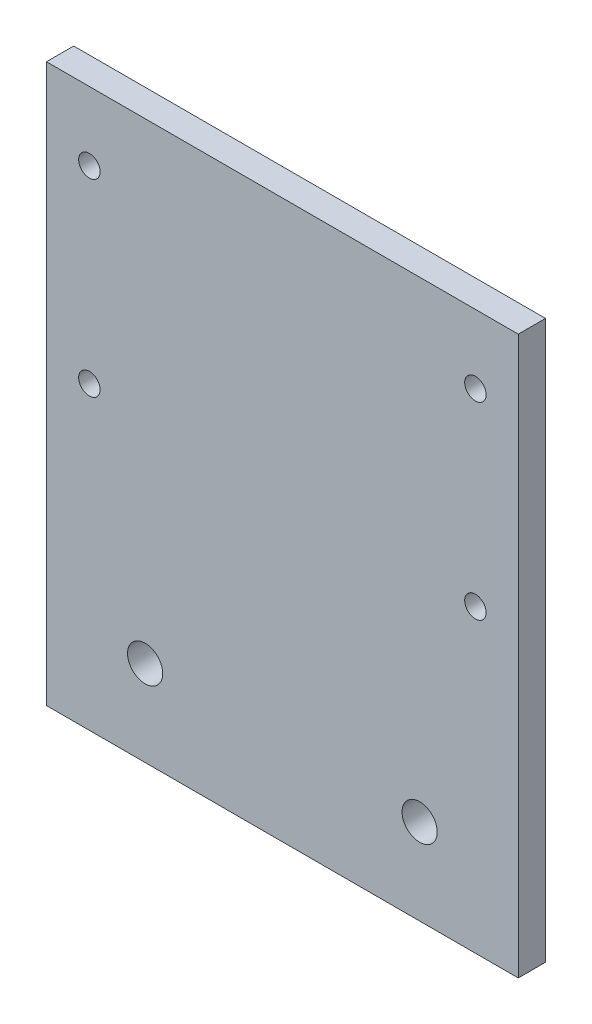
ISO-10303-21;
HEADER;
FILE_DESCRIPTION(('STEP AP214'),'2;1');
FILE_NAME('part.step','',(''),(''),'','','');
FILE_SCHEMA(('AUTOMOTIVE_DESIGN { 1 0 10303 214 1 1 1 1 }'));
ENDSEC;
DATA;
#1=APPLICATION_CONTEXT('core data for automotive mechanical design processes');
#2=APPLICATION_PROTOCOL_DEFINITION('international standard','automotive_design',2000,#1);
#3=PRODUCT_CONTEXT('',#1,'mechanical');
#4=PRODUCT('Part','Part','',(#3));
#5=PRODUCT_RELATED_PRODUCT_CATEGORY('part','',(#4));
#6=PRODUCT_DEFINITION_FORMATION('','',#4);
#7=PRODUCT_DEFINITION_CONTEXT('part definition',#1,'design');
#8=PRODUCT_DEFINITION('design','',#6,#7);
#9=PRODUCT_DEFINITION_SHAPE('','',#8);
#10=(LENGTH_UNIT() NAMED_UNIT(*) SI_UNIT(.MILLI.,.METRE.));
#11=(NAMED_UNIT(*) PLANE_ANGLE_UNIT() SI_UNIT($,.RADIAN.));
#12=(NAMED_UNIT(*) SI_UNIT($,.STERADIAN.) SOLID_ANGLE_UNIT());
#13=UNCERTAINTY_MEASURE_WITH_UNIT(LENGTH_MEASURE(1.E-05),#10,'distance_accuracy_value','');
#14=(GEOMETRIC_REPRESENTATION_CONTEXT(3) GLOBAL_UNCERTAINTY_ASSIGNED_CONTEXT((#13)) GLOBAL_UNIT_ASSIGNED_CONTEXT((#10,
#11,#12)) REPRESENTATION_CONTEXT('',''));
#15=CARTESIAN_POINT('',(0.,0.,0.));
#16=DIRECTION('',(0.,0.,1.));
#17=DIRECTION('',(1.,0.,0.));
#18=AXIS2_PLACEMENT_3D('',#15,#16,#17);
#19=CARTESIAN_POINT('',(0.,0.,3.175));
#20=DIRECTION('',(0.,0.,-1.));
#21=DIRECTION('',(-1.,0.,0.));
#22=AXIS2_PLACEMENT_3D('',#19,#20,#21);
#23=PLANE('',#22);
#24=DIRECTION('',(0.,-1.,0.));
#25=VECTOR('',#24,1.);
#26=CARTESIAN_POINT('',(0.,0.,3.175));
#27=LINE('',#26,#25);
#28=CARTESIAN_POINT('',(0.,65.,3.175));
#29=VERTEX_POINT('',#28);
#30=CARTESIAN_POINT('',(0.,0.,3.175));
#31=VERTEX_POINT('',#30);
#32=EDGE_CURVE('E92',#29,#31,#27,.T.);
#33=ORIENTED_EDGE('',*,*,#32,.T.);
#34=DIRECTION('',(1.,0.,0.));
#35=VECTOR('',#34,1.);
#36=CARTESIAN_POINT('',(0.,0.,3.175));
#37=LINE('',#36,#35);
#38=CARTESIAN_POINT('',(55.,0.,3.175));
#39=VERTEX_POINT('',#38);
#40=EDGE_CURVE('E87',#31,#39,#37,.T.);
#41=ORIENTED_EDGE('',*,*,#40,.T.);
#42=DIRECTION('',(0.,1.,0.));
#43=VECTOR('',#42,1.);
#44=CARTESIAN_POINT('',(55.,0.,3.175));
#45=LINE('',#44,#43);
#46=CARTESIAN_POINT('',(55.,65.,3.175));
#47=VERTEX_POINT('',#46);
#48=EDGE_CURVE('E90',#39,#47,#45,.T.);
#49=ORIENTED_EDGE('',*,*,#48,.T.);
#50=DIRECTION('',(-1.,0.,0.));
#51=VECTOR('',#50,1.);
#52=CARTESIAN_POINT('',(0.,65.,3.175));
#53=LINE('',#52,#51);
#54=EDGE_CURVE('E57',#47,#29,#53,.T.);
#55=ORIENTED_EDGE('',*,*,#54,.T.);
#56=EDGE_LOOP('',(#33,#41,#49,#55));
#57=FACE_BOUND('',#56,.T.);
#58=CARTESIAN_POINT('',(5.,57.,3.175));
#59=DIRECTION('',(0.,0.,1.));
#60=DIRECTION('',(1.,0.,0.));
#61=AXIS2_PLACEMENT_3D('',#58,#59,#60);
#62=CIRCLE('',#61,1.25);
#63=CARTESIAN_POINT('',(6.25,57.,3.175));
#64=VERTEX_POINT('',#63);
#65=EDGE_CURVE('E112',#64,#64,#62,.T.);
#66=ORIENTED_EDGE('',*,*,#65,.F.);
#67=EDGE_LOOP('',(#66));
#68=FACE_BOUND('',#67,.T.);
#69=CARTESIAN_POINT('',(11.5,9.99999999999999,3.175));
#70=DIRECTION('',(0.,0.,1.));
#71=DIRECTION('',(1.,0.,0.));
#72=AXIS2_PLACEMENT_3D('',#69,#70,#71);
#73=CIRCLE('',#72,2.05);
#74=CARTESIAN_POINT('',(13.55,9.99999999999999,3.175));
#75=VERTEX_POINT('',#74);
#76=EDGE_CURVE('E134',#75,#75,#73,.T.);
#77=ORIENTED_EDGE('',*,*,#76,.F.);
#78=EDGE_LOOP('',(#77));
#79=FACE_BOUND('',#78,.T.);
#80=CARTESIAN_POINT('',(50.,57.,3.175));
#81=DIRECTION('',(0.,0.,1.));
#82=DIRECTION('',(1.,0.,0.));
#83=AXIS2_PLACEMENT_3D('',#80,#81,#82);
#84=CIRCLE('',#83,1.25);
#85=CARTESIAN_POINT('',(51.25,57.,3.175));
#86=VERTEX_POINT('',#85);
#87=EDGE_CURVE('E142',#86,#86,#84,.T.);
#88=ORIENTED_EDGE('',*,*,#87,.F.);
#89=EDGE_LOOP('',(#88));
#90=FACE_BOUND('',#89,.T.);
#91=CARTESIAN_POINT('',(50.0000000000002,35.,3.175));
#92=DIRECTION('',(0.,0.,1.));
#93=DIRECTION('',(1.,0.,0.));
#94=AXIS2_PLACEMENT_3D('',#91,#92,#93);
#95=CIRCLE('',#94,1.25);
#96=CARTESIAN_POINT('',(51.2500000000002,35.,3.175));
#97=VERTEX_POINT('',#96);
#98=EDGE_CURVE('E150',#97,#97,#95,.T.);
#99=ORIENTED_EDGE('',*,*,#98,.F.);
#100=EDGE_LOOP('',(#99));
#101=FACE_BOUND('',#100,.T.);
#102=CARTESIAN_POINT('',(5.00000000000023,35.,3.175));
#103=DIRECTION('',(0.,0.,1.));
#104=DIRECTION('',(1.,0.,0.));
#105=AXIS2_PLACEMENT_3D('',#102,#103,#104);
#106=CIRCLE('',#105,1.25);
#107=CARTESIAN_POINT('',(6.25000000000023,35.,3.175));
#108=VERTEX_POINT('',#107);
#109=EDGE_CURVE('E158',#108,#108,#106,.T.);
#110=ORIENTED_EDGE('',*,*,#109,.F.);
#111=EDGE_LOOP('',(#110));
#112=FACE_BOUND('',#111,.T.);
#113=CARTESIAN_POINT('',(43.5,10.,3.175));
#114=DIRECTION('',(0.,0.,1.));
#115=DIRECTION('',(1.,0.,0.));
#116=AXIS2_PLACEMENT_3D('',#113,#114,#115);
#117=CIRCLE('',#116,2.05);
#118=CARTESIAN_POINT('',(45.55,10.,3.175));
#119=VERTEX_POINT('',#118);
#120=EDGE_CURVE('E166',#119,#119,#117,.T.);
#121=ORIENTED_EDGE('',*,*,#120,.F.);
#122=EDGE_LOOP('',(#121));
#123=FACE_BOUND('',#122,.T.);
#124=ADVANCED_FACE('F39',(#57,#68,#79,#90,#101,#112,#123),#23,.F.);
#125=CARTESIAN_POINT('',(0.,0.,0.));
#126=DIRECTION('',(0.,0.,-1.));
#127=DIRECTION('',(-1.,0.,0.));
#128=AXIS2_PLACEMENT_3D('',#125,#126,#127);
#129=PLANE('',#128);
#130=CARTESIAN_POINT('',(5.00000000000023,35.,0.));
#131=DIRECTION('',(0.,0.,1.));
#132=DIRECTION('',(1.,0.,0.));
#133=AXIS2_PLACEMENT_3D('',#130,#131,#132);
#134=CIRCLE('',#133,1.25);
#135=CARTESIAN_POINT('',(6.25000000000023,35.,0.));
#136=VERTEX_POINT('',#135);
#137=EDGE_CURVE('E162',#136,#136,#134,.T.);
#138=ORIENTED_EDGE('',*,*,#137,.T.);
#139=EDGE_LOOP('',(#138));
#140=FACE_BOUND('',#139,.T.);
#141=CARTESIAN_POINT('',(50.,57.,0.));
#142=DIRECTION('',(0.,0.,1.));
#143=DIRECTION('',(1.,0.,0.));
#144=AXIS2_PLACEMENT_3D('',#141,#142,#143);
#145=CIRCLE('',#144,1.25);
#146=CARTESIAN_POINT('',(51.25,57.,0.));
#147=VERTEX_POINT('',#146);
#148=EDGE_CURVE('E146',#147,#147,#145,.T.);
#149=ORIENTED_EDGE('',*,*,#148,.T.);
#150=EDGE_LOOP('',(#149));
#151=FACE_BOUND('',#150,.T.);
#152=CARTESIAN_POINT('',(5.,57.,0.));
#153=DIRECTION('',(0.,0.,1.));
#154=DIRECTION('',(1.,0.,0.));
#155=AXIS2_PLACEMENT_3D('',#152,#153,#154);
#156=CIRCLE('',#155,1.25);
#157=CARTESIAN_POINT('',(6.25,57.,0.));
#158=VERTEX_POINT('',#157);
#159=EDGE_CURVE('E130',#158,#158,#156,.T.);
#160=ORIENTED_EDGE('',*,*,#159,.T.);
#161=EDGE_LOOP('',(#160));
#162=FACE_BOUND('',#161,.T.);
#163=DIRECTION('',(0.,-1.,0.));
#164=VECTOR('',#163,1.);
#165=CARTESIAN_POINT('',(0.,0.,0.));
#166=LINE('',#165,#164);
#167=CARTESIAN_POINT('',(0.,65.,0.));
#168=VERTEX_POINT('',#167);
#169=CARTESIAN_POINT('',(0.,0.,0.));
#170=VERTEX_POINT('',#169);
#171=EDGE_CURVE('E108',#168,#170,#166,.T.);
#172=ORIENTED_EDGE('',*,*,#171,.F.);
#173=DIRECTION('',(-1.,0.,0.));
#174=VECTOR('',#173,1.);
#175=CARTESIAN_POINT('',(0.,65.,0.));
#176=LINE('',#175,#174);
#177=CARTESIAN_POINT('',(55.,65.,0.));
#178=VERTEX_POINT('',#177);
#179=EDGE_CURVE('E80',#178,#168,#176,.T.);
#180=ORIENTED_EDGE('',*,*,#179,.F.);
#181=DIRECTION('',(0.,1.,0.));
#182=VECTOR('',#181,1.);
#183=CARTESIAN_POINT('',(55.,0.,0.));
#184=LINE('',#183,#182);
#185=CARTESIAN_POINT('',(55.,0.,0.));
#186=VERTEX_POINT('',#185);
#187=EDGE_CURVE('E74',#186,#178,#184,.T.);
#188=ORIENTED_EDGE('',*,*,#187,.F.);
#189=DIRECTION('',(1.,0.,0.));
#190=VECTOR('',#189,1.);
#191=CARTESIAN_POINT('',(0.,0.,0.));
#192=LINE('',#191,#190);
#193=EDGE_CURVE('E97',#170,#186,#192,.T.);
#194=ORIENTED_EDGE('',*,*,#193,.F.);
#195=EDGE_LOOP('',(#172,#180,#188,#194));
#196=FACE_BOUND('',#195,.T.);
#197=CARTESIAN_POINT('',(11.5,9.99999999999999,0.));
#198=DIRECTION('',(0.,0.,1.));
#199=DIRECTION('',(1.,0.,0.));
#200=AXIS2_PLACEMENT_3D('',#197,#198,#199);
#201=CIRCLE('',#200,2.05);
#202=CARTESIAN_POINT('',(13.55,9.99999999999999,0.));
#203=VERTEX_POINT('',#202);
#204=EDGE_CURVE('E138',#203,#203,#201,.T.);
#205=ORIENTED_EDGE('',*,*,#204,.T.);
#206=EDGE_LOOP('',(#205));
#207=FACE_BOUND('',#206,.T.);
#208=CARTESIAN_POINT('',(50.0000000000002,35.,0.));
#209=DIRECTION('',(0.,0.,1.));
#210=DIRECTION('',(1.,0.,0.));
#211=AXIS2_PLACEMENT_3D('',#208,#209,#210);
#212=CIRCLE('',#211,1.25);
#213=CARTESIAN_POINT('',(51.2500000000002,35.,0.));
#214=VERTEX_POINT('',#213);
#215=EDGE_CURVE('E154',#214,#214,#212,.T.);
#216=ORIENTED_EDGE('',*,*,#215,.T.);
#217=EDGE_LOOP('',(#216));
#218=FACE_BOUND('',#217,.T.);
#219=CARTESIAN_POINT('',(43.5,10.,0.));
#220=DIRECTION('',(0.,0.,1.));
#221=DIRECTION('',(1.,0.,0.));
#222=AXIS2_PLACEMENT_3D('',#219,#220,#221);
#223=CIRCLE('',#222,2.05);
#224=CARTESIAN_POINT('',(45.55,10.,0.));
#225=VERTEX_POINT('',#224);
#226=EDGE_CURVE('E170',#225,#225,#223,.T.);
#227=ORIENTED_EDGE('',*,*,#226,.T.);
#228=EDGE_LOOP('',(#227));
#229=FACE_BOUND('',#228,.T.);
#230=ADVANCED_FACE('F125',(#140,#151,#162,#196,#207,#218,#229),#129,.T.);
#231=CARTESIAN_POINT('',(0.,0.,3.175));
#232=DIRECTION('',(1.,0.,0.));
#233=DIRECTION('',(0.,0.,-1.));
#234=AXIS2_PLACEMENT_3D('',#231,#232,#233);
#235=PLANE('',#234);
#236=ORIENTED_EDGE('',*,*,#171,.T.);
#237=DIRECTION('',(0.,0.,-1.));
#238=VECTOR('',#237,1.);
#239=CARTESIAN_POINT('',(0.,0.,3.175));
#240=LINE('',#239,#238);
#241=EDGE_CURVE('E11',#31,#170,#240,.T.);
#242=ORIENTED_EDGE('',*,*,#241,.F.);
#243=ORIENTED_EDGE('',*,*,#32,.F.);
#244=DIRECTION('',(0.,0.,-1.));
#245=VECTOR('',#244,1.);
#246=CARTESIAN_POINT('',(0.,65.,3.175));
#247=LINE('',#246,#245);
#248=EDGE_CURVE('E104',#29,#168,#247,.T.);
#249=ORIENTED_EDGE('',*,*,#248,.T.);
#250=EDGE_LOOP('',(#236,#242,#243,#249));
#251=FACE_BOUND('',#250,.T.);
#252=ADVANCED_FACE('F41',(#251),#235,.F.);
#253=CARTESIAN_POINT('',(0.,0.,3.175));
#254=DIRECTION('',(0.,1.,0.));
#255=DIRECTION('',(-1.,0.,0.));
#256=AXIS2_PLACEMENT_3D('',#253,#254,#255);
#257=PLANE('',#256);
#258=ORIENTED_EDGE('',*,*,#193,.T.);
#259=DIRECTION('',(0.,0.,-1.));
#260=VECTOR('',#259,1.);
#261=CARTESIAN_POINT('',(55.,0.,3.175));
#262=LINE('',#261,#260);
#263=EDGE_CURVE('E49',#39,#186,#262,.T.);
#264=ORIENTED_EDGE('',*,*,#263,.F.);
#265=ORIENTED_EDGE('',*,*,#40,.F.);
#266=ORIENTED_EDGE('',*,*,#241,.T.);
#267=EDGE_LOOP('',(#258,#264,#265,#266));
#268=FACE_BOUND('',#267,.T.);
#269=ADVANCED_FACE('F96',(#268),#257,.F.);
#270=CARTESIAN_POINT('',(55.,0.,3.175));
#271=DIRECTION('',(-1.,0.,0.));
#272=DIRECTION('',(0.,-1.,0.));
#273=AXIS2_PLACEMENT_3D('',#270,#271,#272);
#274=PLANE('',#273);
#275=ORIENTED_EDGE('',*,*,#187,.T.);
#276=DIRECTION('',(0.,0.,-1.));
#277=VECTOR('',#276,1.);
#278=CARTESIAN_POINT('',(55.,65.,3.175));
#279=LINE('',#278,#277);
#280=EDGE_CURVE('E99',#47,#178,#279,.T.);
#281=ORIENTED_EDGE('',*,*,#280,.F.);
#282=ORIENTED_EDGE('',*,*,#48,.F.);
#283=ORIENTED_EDGE('',*,*,#263,.T.);
#284=EDGE_LOOP('',(#275,#281,#282,#283));
#285=FACE_BOUND('',#284,.T.);
#286=ADVANCED_FACE('F100',(#285),#274,.F.);
#287=CARTESIAN_POINT('',(0.,65.,3.175));
#288=DIRECTION('',(0.,-1.,0.));
#289=DIRECTION('',(0.,0.,-1.));
#290=AXIS2_PLACEMENT_3D('',#287,#288,#289);
#291=PLANE('',#290);
#292=ORIENTED_EDGE('',*,*,#179,.T.);
#293=ORIENTED_EDGE('',*,*,#248,.F.);
#294=ORIENTED_EDGE('',*,*,#54,.F.);
#295=ORIENTED_EDGE('',*,*,#280,.T.);
#296=EDGE_LOOP('',(#292,#293,#294,#295));
#297=FACE_BOUND('',#296,.T.);
#298=ADVANCED_FACE('F122',(#297),#291,.F.);
#299=CARTESIAN_POINT('',(5.,57.,3.175));
#300=DIRECTION('',(0.,0.,-1.));
#301=DIRECTION('',(-1.,0.,0.));
#302=AXIS2_PLACEMENT_3D('',#299,#300,#301);
#303=CYLINDRICAL_SURFACE('',#302,1.25);
#304=ORIENTED_EDGE('',*,*,#65,.T.);
#305=EDGE_LOOP('',(#304));
#306=FACE_BOUND('',#305,.T.);
#307=ORIENTED_EDGE('',*,*,#159,.F.);
#308=EDGE_LOOP('',(#307));
#309=FACE_BOUND('',#308,.T.);
#310=ADVANCED_FACE('F189',(#306,#309),#303,.F.);
#311=CARTESIAN_POINT('',(11.5,9.99999999999999,3.175));
#312=DIRECTION('',(0.,0.,-1.));
#313=DIRECTION('',(-1.,0.,0.));
#314=AXIS2_PLACEMENT_3D('',#311,#312,#313);
#315=CYLINDRICAL_SURFACE('',#314,2.05);
#316=ORIENTED_EDGE('',*,*,#76,.T.);
#317=EDGE_LOOP('',(#316));
#318=FACE_BOUND('',#317,.T.);
#319=ORIENTED_EDGE('',*,*,#204,.F.);
#320=EDGE_LOOP('',(#319));
#321=FACE_BOUND('',#320,.T.);
#322=ADVANCED_FACE('F235',(#318,#321),#315,.F.);
#323=CARTESIAN_POINT('',(50.,57.,3.175));
#324=DIRECTION('',(0.,0.,-1.));
#325=DIRECTION('',(-1.,0.,0.));
#326=AXIS2_PLACEMENT_3D('',#323,#324,#325);
#327=CYLINDRICAL_SURFACE('',#326,1.25);
#328=ORIENTED_EDGE('',*,*,#87,.T.);
#329=EDGE_LOOP('',(#328));
#330=FACE_BOUND('',#329,.T.);
#331=ORIENTED_EDGE('',*,*,#148,.F.);
#332=EDGE_LOOP('',(#331));
#333=FACE_BOUND('',#332,.T.);
#334=ADVANCED_FACE('F243',(#330,#333),#327,.F.);
#335=CARTESIAN_POINT('',(50.0000000000002,35.,3.175));
#336=DIRECTION('',(0.,0.,-1.));
#337=DIRECTION('',(-1.,0.,0.));
#338=AXIS2_PLACEMENT_3D('',#335,#336,#337);
#339=CYLINDRICAL_SURFACE('',#338,1.25);
#340=ORIENTED_EDGE('',*,*,#98,.T.);
#341=EDGE_LOOP('',(#340));
#342=FACE_BOUND('',#341,.T.);
#343=ORIENTED_EDGE('',*,*,#215,.F.);
#344=EDGE_LOOP('',(#343));
#345=FACE_BOUND('',#344,.T.);
#346=ADVANCED_FACE('F251',(#342,#345),#339,.F.);
#347=CARTESIAN_POINT('',(5.00000000000023,35.,3.175));
#348=DIRECTION('',(0.,0.,-1.));
#349=DIRECTION('',(-1.,0.,0.));
#350=AXIS2_PLACEMENT_3D('',#347,#348,#349);
#351=CYLINDRICAL_SURFACE('',#350,1.25);
#352=ORIENTED_EDGE('',*,*,#109,.T.);
#353=EDGE_LOOP('',(#352));
#354=FACE_BOUND('',#353,.T.);
#355=ORIENTED_EDGE('',*,*,#137,.F.);
#356=EDGE_LOOP('',(#355));
#357=FACE_BOUND('',#356,.T.);
#358=ADVANCED_FACE('F260',(#354,#357),#351,.F.);
#359=CARTESIAN_POINT('',(43.5,10.,3.175));
#360=DIRECTION('',(0.,0.,-1.));
#361=DIRECTION('',(-1.,0.,0.));
#362=AXIS2_PLACEMENT_3D('',#359,#360,#361);
#363=CYLINDRICAL_SURFACE('',#362,2.05);
#364=ORIENTED_EDGE('',*,*,#120,.T.);
#365=EDGE_LOOP('',(#364));
#366=FACE_BOUND('',#365,.T.);
#367=ORIENTED_EDGE('',*,*,#226,.F.);
#368=EDGE_LOOP('',(#367));
#369=FACE_BOUND('',#368,.T.);
#370=ADVANCED_FACE('F178',(#366,#369),#363,.F.);
#371=CLOSED_SHELL('',(#124,#230,#252,#269,#286,#298,#310,#322,#334,#346,#358,#370));
#372=MANIFOLD_SOLID_BREP('B2',#371);
#373=ADVANCED_BREP_SHAPE_REPRESENTATION('',(#18,#372),#14);
#374=SHAPE_DEFINITION_REPRESENTATION(#9,#373);
ENDSEC;
END-ISO-10303-21;
